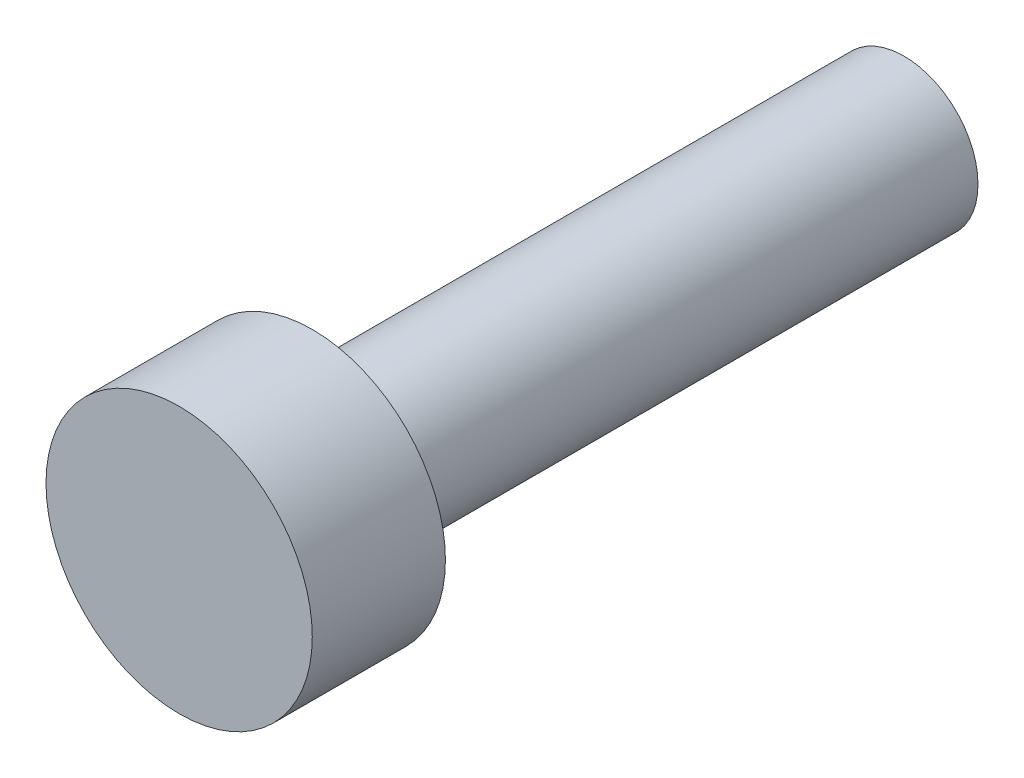
ISO-10303-21;
HEADER;
FILE_DESCRIPTION(('STEP AP214'),'2;1');
FILE_NAME('part.step','',(''),(''),'','','');
FILE_SCHEMA(('AUTOMOTIVE_DESIGN { 1 0 10303 214 1 1 1 1 }'));
ENDSEC;
DATA;
#1=APPLICATION_CONTEXT('core data for automotive mechanical design processes');
#2=APPLICATION_PROTOCOL_DEFINITION('international standard','automotive_design',2000,#1);
#3=PRODUCT_CONTEXT('',#1,'mechanical');
#4=PRODUCT('Part','Part','',(#3));
#5=PRODUCT_RELATED_PRODUCT_CATEGORY('part','',(#4));
#6=PRODUCT_DEFINITION_FORMATION('','',#4);
#7=PRODUCT_DEFINITION_CONTEXT('part definition',#1,'design');
#8=PRODUCT_DEFINITION('design','',#6,#7);
#9=PRODUCT_DEFINITION_SHAPE('','',#8);
#10=(LENGTH_UNIT() NAMED_UNIT(*) SI_UNIT(.MILLI.,.METRE.));
#11=(NAMED_UNIT(*) PLANE_ANGLE_UNIT() SI_UNIT($,.RADIAN.));
#12=(NAMED_UNIT(*) SI_UNIT($,.STERADIAN.) SOLID_ANGLE_UNIT());
#13=UNCERTAINTY_MEASURE_WITH_UNIT(LENGTH_MEASURE(1.E-05),#10,'distance_accuracy_value','');
#14=(GEOMETRIC_REPRESENTATION_CONTEXT(3) GLOBAL_UNCERTAINTY_ASSIGNED_CONTEXT((#13)) GLOBAL_UNIT_ASSIGNED_CONTEXT((#10,
#11,#12)) REPRESENTATION_CONTEXT('',''));
#15=CARTESIAN_POINT('',(0.,0.,0.));
#16=DIRECTION('',(0.,0.,1.));
#17=DIRECTION('',(1.,0.,0.));
#18=AXIS2_PLACEMENT_3D('',#15,#16,#17);
#19=CARTESIAN_POINT('',(0.,0.,8.));
#20=DIRECTION('',(0.,0.,-1.));
#21=DIRECTION('',(-1.,0.,0.));
#22=AXIS2_PLACEMENT_3D('',#19,#20,#21);
#23=CYLINDRICAL_SURFACE('',#22,1.);
#24=CARTESIAN_POINT('',(0.,0.,8.));
#25=DIRECTION('',(0.,0.,1.));
#26=DIRECTION('',(1.,0.,0.));
#27=AXIS2_PLACEMENT_3D('',#24,#25,#26);
#28=CIRCLE('',#27,1.);
#29=CARTESIAN_POINT('',(1.,0.,8.));
#30=VERTEX_POINT('',#29);
#31=EDGE_CURVE('E10',#30,#30,#28,.T.);
#32=ORIENTED_EDGE('',*,*,#31,.F.);
#33=EDGE_LOOP('',(#32));
#34=FACE_BOUND('',#33,.T.);
#35=CARTESIAN_POINT('',(0.,0.,0.));
#36=DIRECTION('',(0.,0.,1.));
#37=DIRECTION('',(1.,0.,0.));
#38=AXIS2_PLACEMENT_3D('',#35,#36,#37);
#39=CIRCLE('',#38,1.);
#40=CARTESIAN_POINT('',(1.,0.,0.));
#41=VERTEX_POINT('',#40);
#42=EDGE_CURVE('E36',#41,#41,#39,.T.);
#43=ORIENTED_EDGE('',*,*,#42,.T.);
#44=EDGE_LOOP('',(#43));
#45=FACE_BOUND('',#44,.T.);
#46=ADVANCED_FACE('F33',(#34,#45),#23,.T.);
#47=CARTESIAN_POINT('',(0.,0.,0.));
#48=DIRECTION('',(0.,0.,1.));
#49=DIRECTION('',(1.,0.,0.));
#50=AXIS2_PLACEMENT_3D('',#47,#48,#49);
#51=PLANE('',#50);
#52=ORIENTED_EDGE('',*,*,#42,.F.);
#53=EDGE_LOOP('',(#52));
#54=FACE_BOUND('',#53,.T.);
#55=ADVANCED_FACE('F56',(#54),#51,.F.);
#56=CARTESIAN_POINT('',(0.,0.,9.8));
#57=DIRECTION('',(0.,0.,-1.));
#58=DIRECTION('',(-1.,0.,0.));
#59=AXIS2_PLACEMENT_3D('',#56,#57,#58);
#60=CYLINDRICAL_SURFACE('',#59,1.8);
#61=CARTESIAN_POINT('',(0.,0.,9.8));
#62=DIRECTION('',(0.,0.,1.));
#63=DIRECTION('',(1.,0.,0.));
#64=AXIS2_PLACEMENT_3D('',#61,#62,#63);
#65=CIRCLE('',#64,1.8);
#66=CARTESIAN_POINT('',(1.8,0.,9.8));
#67=VERTEX_POINT('',#66);
#68=EDGE_CURVE('E43',#67,#67,#65,.T.);
#69=ORIENTED_EDGE('',*,*,#68,.F.);
#70=EDGE_LOOP('',(#69));
#71=FACE_BOUND('',#70,.T.);
#72=CARTESIAN_POINT('',(0.,0.,8.));
#73=DIRECTION('',(0.,0.,1.));
#74=DIRECTION('',(1.,0.,0.));
#75=AXIS2_PLACEMENT_3D('',#72,#73,#74);
#76=CIRCLE('',#75,1.8);
#77=CARTESIAN_POINT('',(1.8,0.,8.));
#78=VERTEX_POINT('',#77);
#79=EDGE_CURVE('E45',#78,#78,#76,.T.);
#80=ORIENTED_EDGE('',*,*,#79,.T.);
#81=EDGE_LOOP('',(#80));
#82=FACE_BOUND('',#81,.T.);
#83=ADVANCED_FACE('F53',(#71,#82),#60,.T.);
#84=CARTESIAN_POINT('',(0.,0.,9.8));
#85=DIRECTION('',(0.,0.,1.));
#86=DIRECTION('',(1.,0.,0.));
#87=AXIS2_PLACEMENT_3D('',#84,#85,#86);
#88=PLANE('',#87);
#89=ORIENTED_EDGE('',*,*,#68,.T.);
#90=EDGE_LOOP('',(#89));
#91=FACE_BOUND('',#90,.T.);
#92=ADVANCED_FACE('F51',(#91),#88,.T.);
#93=CARTESIAN_POINT('',(0.,0.,8.));
#94=DIRECTION('',(0.,0.,1.));
#95=DIRECTION('',(1.,0.,0.));
#96=AXIS2_PLACEMENT_3D('',#93,#94,#95);
#97=PLANE('',#96);
#98=ORIENTED_EDGE('',*,*,#31,.T.);
#99=EDGE_LOOP('',(#98));
#100=FACE_BOUND('',#99,.T.);
#101=ORIENTED_EDGE('',*,*,#79,.F.);
#102=EDGE_LOOP('',(#101));
#103=FACE_BOUND('',#102,.T.);
#104=ADVANCED_FACE('F60',(#100,#103),#97,.F.);
#105=CLOSED_SHELL('',(#46,#55,#83,#92,#104));
#106=MANIFOLD_SOLID_BREP('B2',#105);
#107=ADVANCED_BREP_SHAPE_REPRESENTATION('',(#18,#106),#14);
#108=SHAPE_DEFINITION_REPRESENTATION(#9,#107);
ENDSEC;
END-ISO-10303-21;
